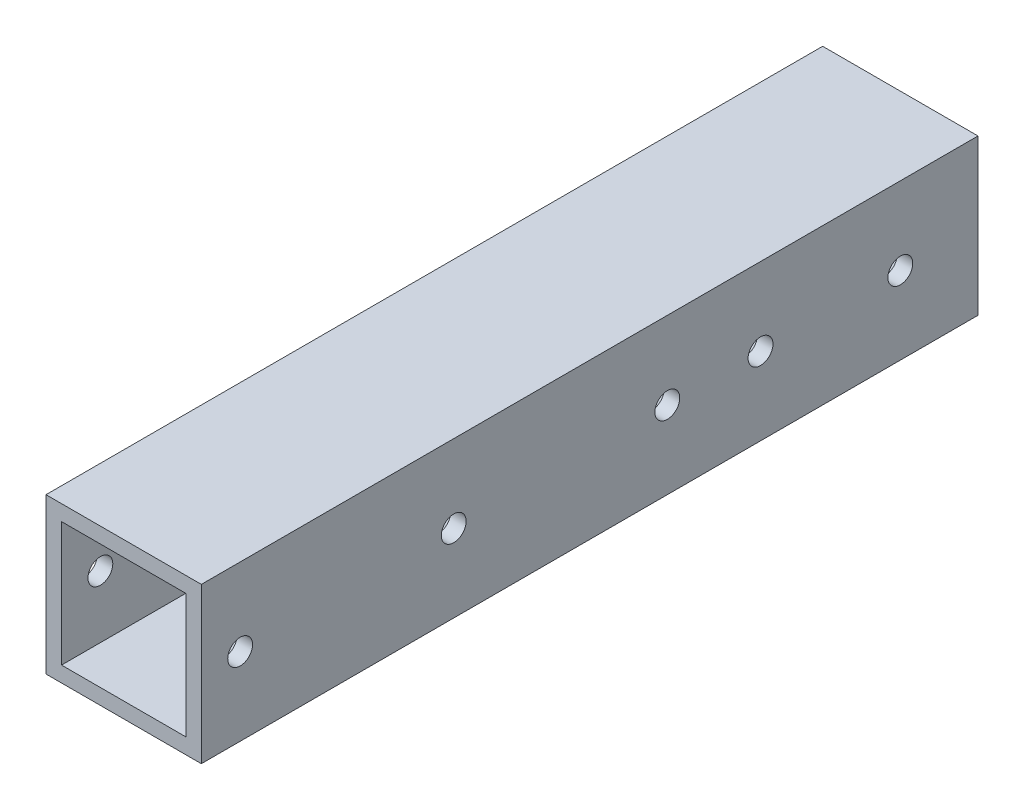
ISO-10303-21;
HEADER;
FILE_DESCRIPTION(('STEP AP214'),'2;1');
FILE_NAME('part.step','',(''),(''),'','','');
FILE_SCHEMA(('AUTOMOTIVE_DESIGN { 1 0 10303 214 1 1 1 1 }'));
ENDSEC;
DATA;
#1=APPLICATION_CONTEXT('core data for automotive mechanical design processes');
#2=APPLICATION_PROTOCOL_DEFINITION('international standard','automotive_design',2000,#1);
#3=PRODUCT_CONTEXT('',#1,'mechanical');
#4=PRODUCT('Part','Part','',(#3));
#5=PRODUCT_RELATED_PRODUCT_CATEGORY('part','',(#4));
#6=PRODUCT_DEFINITION_FORMATION('','',#4);
#7=PRODUCT_DEFINITION_CONTEXT('part definition',#1,'design');
#8=PRODUCT_DEFINITION('design','',#6,#7);
#9=PRODUCT_DEFINITION_SHAPE('','',#8);
#10=(LENGTH_UNIT() NAMED_UNIT(*) SI_UNIT(.MILLI.,.METRE.));
#11=(NAMED_UNIT(*) PLANE_ANGLE_UNIT() SI_UNIT($,.RADIAN.));
#12=(NAMED_UNIT(*) SI_UNIT($,.STERADIAN.) SOLID_ANGLE_UNIT());
#13=UNCERTAINTY_MEASURE_WITH_UNIT(LENGTH_MEASURE(1.E-05),#10,'distance_accuracy_value','');
#14=(GEOMETRIC_REPRESENTATION_CONTEXT(3) GLOBAL_UNCERTAINTY_ASSIGNED_CONTEXT((#13)) GLOBAL_UNIT_ASSIGNED_CONTEXT((#10,
#11,#12)) REPRESENTATION_CONTEXT('',''));
#15=CARTESIAN_POINT('',(0.,0.,0.));
#16=DIRECTION('',(0.,0.,1.));
#17=DIRECTION('',(1.,0.,0.));
#18=AXIS2_PLACEMENT_3D('',#15,#16,#17);
#19=CARTESIAN_POINT('',(0.,0.,100.));
#20=DIRECTION('',(0.,0.,1.));
#21=DIRECTION('',(1.,0.,0.));
#22=AXIS2_PLACEMENT_3D('',#19,#20,#21);
#23=PLANE('',#22);
#24=DIRECTION('',(0.,-1.,0.));
#25=VECTOR('',#24,1.);
#26=CARTESIAN_POINT('',(0.,0.,100.));
#27=LINE('',#26,#25);
#28=CARTESIAN_POINT('',(0.,20.,100.));
#29=VERTEX_POINT('',#28);
#30=CARTESIAN_POINT('',(0.,0.,100.));
#31=VERTEX_POINT('',#30);
#32=EDGE_CURVE('E176',#29,#31,#27,.T.);
#33=ORIENTED_EDGE('',*,*,#32,.T.);
#34=DIRECTION('',(1.,0.,0.));
#35=VECTOR('',#34,1.);
#36=CARTESIAN_POINT('',(0.,0.,100.));
#37=LINE('',#36,#35);
#38=CARTESIAN_POINT('',(20.,0.,100.));
#39=VERTEX_POINT('',#38);
#40=EDGE_CURVE('E179',#31,#39,#37,.T.);
#41=ORIENTED_EDGE('',*,*,#40,.T.);
#42=DIRECTION('',(0.,1.,0.));
#43=VECTOR('',#42,1.);
#44=CARTESIAN_POINT('',(20.,0.,100.));
#45=LINE('',#44,#43);
#46=CARTESIAN_POINT('',(20.,20.,100.));
#47=VERTEX_POINT('',#46);
#48=EDGE_CURVE('E182',#39,#47,#45,.T.);
#49=ORIENTED_EDGE('',*,*,#48,.T.);
#50=DIRECTION('',(-1.,0.,0.));
#51=VECTOR('',#50,1.);
#52=CARTESIAN_POINT('',(0.,20.,100.));
#53=LINE('',#52,#51);
#54=EDGE_CURVE('E184',#47,#29,#53,.T.);
#55=ORIENTED_EDGE('',*,*,#54,.T.);
#56=EDGE_LOOP('',(#33,#41,#49,#55));
#57=FACE_BOUND('',#56,.T.);
#58=DIRECTION('',(1.,0.,0.));
#59=VECTOR('',#58,1.);
#60=CARTESIAN_POINT('',(0.,2.,100.));
#61=LINE('',#60,#59);
#62=CARTESIAN_POINT('',(2.,2.,100.));
#63=VERTEX_POINT('',#62);
#64=CARTESIAN_POINT('',(18.,2.,100.));
#65=VERTEX_POINT('',#64);
#66=EDGE_CURVE('E146',#63,#65,#61,.T.);
#67=ORIENTED_EDGE('',*,*,#66,.F.);
#68=DIRECTION('',(0.,-1.,0.));
#69=VECTOR('',#68,1.);
#70=CARTESIAN_POINT('',(2.,0.,100.));
#71=LINE('',#70,#69);
#72=CARTESIAN_POINT('',(2.,18.,100.));
#73=VERTEX_POINT('',#72);
#74=EDGE_CURVE('E138',#73,#63,#71,.T.);
#75=ORIENTED_EDGE('',*,*,#74,.F.);
#76=DIRECTION('',(-1.,0.,0.));
#77=VECTOR('',#76,1.);
#78=CARTESIAN_POINT('',(0.,18.,100.));
#79=LINE('',#78,#77);
#80=CARTESIAN_POINT('',(18.,18.,100.));
#81=VERTEX_POINT('',#80);
#82=EDGE_CURVE('E160',#81,#73,#79,.T.);
#83=ORIENTED_EDGE('',*,*,#82,.F.);
#84=DIRECTION('',(0.,1.,0.));
#85=VECTOR('',#84,1.);
#86=CARTESIAN_POINT('',(18.,0.,100.));
#87=LINE('',#86,#85);
#88=EDGE_CURVE('E158',#65,#81,#87,.T.);
#89=ORIENTED_EDGE('',*,*,#88,.F.);
#90=EDGE_LOOP('',(#67,#75,#83,#89));
#91=FACE_BOUND('',#90,.T.);
#92=ADVANCED_FACE('F71',(#57,#91),#23,.T.);
#93=CARTESIAN_POINT('',(0.,0.,0.));
#94=DIRECTION('',(0.,0.,1.));
#95=DIRECTION('',(1.,0.,0.));
#96=AXIS2_PLACEMENT_3D('',#93,#94,#95);
#97=PLANE('',#96);
#98=DIRECTION('',(0.,-1.,0.));
#99=VECTOR('',#98,1.);
#100=CARTESIAN_POINT('',(0.,0.,0.));
#101=LINE('',#100,#99);
#102=CARTESIAN_POINT('',(0.,20.,0.));
#103=VERTEX_POINT('',#102);
#104=CARTESIAN_POINT('',(0.,0.,0.));
#105=VERTEX_POINT('',#104);
#106=EDGE_CURVE('E154',#103,#105,#101,.T.);
#107=ORIENTED_EDGE('',*,*,#106,.F.);
#108=DIRECTION('',(-1.,0.,0.));
#109=VECTOR('',#108,1.);
#110=CARTESIAN_POINT('',(0.,20.,0.));
#111=LINE('',#110,#109);
#112=CARTESIAN_POINT('',(20.,20.,0.));
#113=VERTEX_POINT('',#112);
#114=EDGE_CURVE('E180',#113,#103,#111,.T.);
#115=ORIENTED_EDGE('',*,*,#114,.F.);
#116=DIRECTION('',(0.,1.,0.));
#117=VECTOR('',#116,1.);
#118=CARTESIAN_POINT('',(20.,0.,0.));
#119=LINE('',#118,#117);
#120=CARTESIAN_POINT('',(20.,0.,0.));
#121=VERTEX_POINT('',#120);
#122=EDGE_CURVE('E191',#121,#113,#119,.T.);
#123=ORIENTED_EDGE('',*,*,#122,.F.);
#124=DIRECTION('',(1.,0.,0.));
#125=VECTOR('',#124,1.);
#126=CARTESIAN_POINT('',(0.,0.,0.));
#127=LINE('',#126,#125);
#128=EDGE_CURVE('E189',#105,#121,#127,.T.);
#129=ORIENTED_EDGE('',*,*,#128,.F.);
#130=EDGE_LOOP('',(#107,#115,#123,#129));
#131=FACE_BOUND('',#130,.T.);
#132=DIRECTION('',(0.,-1.,0.));
#133=VECTOR('',#132,1.);
#134=CARTESIAN_POINT('',(2.,0.,0.));
#135=LINE('',#134,#133);
#136=CARTESIAN_POINT('',(2.,18.,0.));
#137=VERTEX_POINT('',#136);
#138=CARTESIAN_POINT('',(2.,2.,0.));
#139=VERTEX_POINT('',#138);
#140=EDGE_CURVE('E96',#137,#139,#135,.T.);
#141=ORIENTED_EDGE('',*,*,#140,.T.);
#142=DIRECTION('',(1.,0.,0.));
#143=VECTOR('',#142,1.);
#144=CARTESIAN_POINT('',(0.,2.,0.));
#145=LINE('',#144,#143);
#146=CARTESIAN_POINT('',(18.,2.,0.));
#147=VERTEX_POINT('',#146);
#148=EDGE_CURVE('E153',#139,#147,#145,.T.);
#149=ORIENTED_EDGE('',*,*,#148,.T.);
#150=DIRECTION('',(0.,1.,0.));
#151=VECTOR('',#150,1.);
#152=CARTESIAN_POINT('',(18.,0.,0.));
#153=LINE('',#152,#151);
#154=CARTESIAN_POINT('',(18.,18.,0.));
#155=VERTEX_POINT('',#154);
#156=EDGE_CURVE('E168',#147,#155,#153,.T.);
#157=ORIENTED_EDGE('',*,*,#156,.T.);
#158=DIRECTION('',(-1.,0.,0.));
#159=VECTOR('',#158,1.);
#160=CARTESIAN_POINT('',(0.,18.,0.));
#161=LINE('',#160,#159);
#162=EDGE_CURVE('E147',#155,#137,#161,.T.);
#163=ORIENTED_EDGE('',*,*,#162,.T.);
#164=EDGE_LOOP('',(#141,#149,#157,#163));
#165=FACE_BOUND('',#164,.T.);
#166=ADVANCED_FACE('F267',(#131,#165),#97,.F.);
#167=CARTESIAN_POINT('',(0.,0.,100.));
#168=DIRECTION('',(1.,0.,0.));
#169=DIRECTION('',(0.,0.,-1.));
#170=AXIS2_PLACEMENT_3D('',#167,#168,#169);
#171=PLANE('',#170);
#172=CARTESIAN_POINT('',(0.,10.,95.));
#173=DIRECTION('',(-1.,0.,0.));
#174=DIRECTION('',(0.,0.,1.));
#175=AXIS2_PLACEMENT_3D('',#172,#173,#174);
#176=CIRCLE('',#175,1.6);
#177=CARTESIAN_POINT('',(0.,10.,96.6));
#178=VERTEX_POINT('',#177);
#179=EDGE_CURVE('E351',#178,#178,#176,.T.);
#180=ORIENTED_EDGE('',*,*,#179,.F.);
#181=EDGE_LOOP('',(#180));
#182=FACE_BOUND('',#181,.T.);
#183=CARTESIAN_POINT('',(0.,9.99999999999999,40.));
#184=DIRECTION('',(-1.,0.,0.));
#185=DIRECTION('',(0.,0.,1.));
#186=AXIS2_PLACEMENT_3D('',#183,#184,#185);
#187=CIRCLE('',#186,1.6);
#188=CARTESIAN_POINT('',(0.,9.99999999999999,41.6));
#189=VERTEX_POINT('',#188);
#190=EDGE_CURVE('E345',#189,#189,#187,.T.);
#191=ORIENTED_EDGE('',*,*,#190,.F.);
#192=EDGE_LOOP('',(#191));
#193=FACE_BOUND('',#192,.T.);
#194=CARTESIAN_POINT('',(0.,9.99999999999999,67.5));
#195=DIRECTION('',(-1.,0.,0.));
#196=DIRECTION('',(0.,0.,1.));
#197=AXIS2_PLACEMENT_3D('',#194,#195,#196);
#198=CIRCLE('',#197,1.6);
#199=CARTESIAN_POINT('',(0.,9.99999999999999,69.1));
#200=VERTEX_POINT('',#199);
#201=EDGE_CURVE('E225',#200,#200,#198,.T.);
#202=ORIENTED_EDGE('',*,*,#201,.F.);
#203=EDGE_LOOP('',(#202));
#204=FACE_BOUND('',#203,.T.);
#205=CARTESIAN_POINT('',(0.,10.,10.));
#206=DIRECTION('',(-1.,0.,0.));
#207=DIRECTION('',(0.,0.,1.));
#208=AXIS2_PLACEMENT_3D('',#205,#206,#207);
#209=CIRCLE('',#208,1.6);
#210=CARTESIAN_POINT('',(0.,10.,11.6));
#211=VERTEX_POINT('',#210);
#212=EDGE_CURVE('E234',#211,#211,#209,.T.);
#213=ORIENTED_EDGE('',*,*,#212,.F.);
#214=EDGE_LOOP('',(#213));
#215=FACE_BOUND('',#214,.T.);
#216=CARTESIAN_POINT('',(0.,10.,28.));
#217=DIRECTION('',(-1.,0.,0.));
#218=DIRECTION('',(0.,0.,1.));
#219=AXIS2_PLACEMENT_3D('',#216,#217,#218);
#220=CIRCLE('',#219,1.60000000000001);
#221=CARTESIAN_POINT('',(0.,10.,29.6));
#222=VERTEX_POINT('',#221);
#223=EDGE_CURVE('E237',#222,#222,#220,.T.);
#224=ORIENTED_EDGE('',*,*,#223,.F.);
#225=EDGE_LOOP('',(#224));
#226=FACE_BOUND('',#225,.T.);
#227=ORIENTED_EDGE('',*,*,#106,.T.);
#228=DIRECTION('',(0.,0.,-1.));
#229=VECTOR('',#228,1.);
#230=CARTESIAN_POINT('',(0.,0.,100.));
#231=LINE('',#230,#229);
#232=EDGE_CURVE('E12',#31,#105,#231,.T.);
#233=ORIENTED_EDGE('',*,*,#232,.F.);
#234=ORIENTED_EDGE('',*,*,#32,.F.);
#235=DIRECTION('',(0.,0.,-1.));
#236=VECTOR('',#235,1.);
#237=CARTESIAN_POINT('',(0.,20.,100.));
#238=LINE('',#237,#236);
#239=EDGE_CURVE('E186',#29,#103,#238,.T.);
#240=ORIENTED_EDGE('',*,*,#239,.T.);
#241=EDGE_LOOP('',(#227,#233,#234,#240));
#242=FACE_BOUND('',#241,.T.);
#243=ADVANCED_FACE('F73',(#182,#193,#204,#215,#226,#242),#171,.F.);
#244=CARTESIAN_POINT('',(0.,0.,100.));
#245=DIRECTION('',(0.,1.,0.));
#246=DIRECTION('',(0.,0.,1.));
#247=AXIS2_PLACEMENT_3D('',#244,#245,#246);
#248=PLANE('',#247);
#249=ORIENTED_EDGE('',*,*,#128,.T.);
#250=DIRECTION('',(0.,0.,-1.));
#251=VECTOR('',#250,1.);
#252=CARTESIAN_POINT('',(20.,0.,100.));
#253=LINE('',#252,#251);
#254=EDGE_CURVE('E80',#39,#121,#253,.T.);
#255=ORIENTED_EDGE('',*,*,#254,.F.);
#256=ORIENTED_EDGE('',*,*,#40,.F.);
#257=ORIENTED_EDGE('',*,*,#232,.T.);
#258=EDGE_LOOP('',(#249,#255,#256,#257));
#259=FACE_BOUND('',#258,.T.);
#260=ADVANCED_FACE('F266',(#259),#248,.F.);
#261=CARTESIAN_POINT('',(20.,0.,100.));
#262=DIRECTION('',(-1.,0.,0.));
#263=DIRECTION('',(0.,0.,1.));
#264=AXIS2_PLACEMENT_3D('',#261,#262,#263);
#265=PLANE('',#264);
#266=CARTESIAN_POINT('',(20.,10.,95.));
#267=DIRECTION('',(-1.,0.,0.));
#268=DIRECTION('',(0.,0.,1.));
#269=AXIS2_PLACEMENT_3D('',#266,#267,#268);
#270=CIRCLE('',#269,1.6);
#271=CARTESIAN_POINT('',(20.,10.,96.6));
#272=VERTEX_POINT('',#271);
#273=EDGE_CURVE('E356',#272,#272,#270,.T.);
#274=ORIENTED_EDGE('',*,*,#273,.T.);
#275=EDGE_LOOP('',(#274));
#276=FACE_BOUND('',#275,.T.);
#277=CARTESIAN_POINT('',(20.,9.99999999999999,40.));
#278=DIRECTION('',(-1.,0.,0.));
#279=DIRECTION('',(0.,0.,1.));
#280=AXIS2_PLACEMENT_3D('',#277,#278,#279);
#281=CIRCLE('',#280,1.6);
#282=CARTESIAN_POINT('',(20.,9.99999999999999,41.6));
#283=VERTEX_POINT('',#282);
#284=EDGE_CURVE('E347',#283,#283,#281,.T.);
#285=ORIENTED_EDGE('',*,*,#284,.T.);
#286=EDGE_LOOP('',(#285));
#287=FACE_BOUND('',#286,.T.);
#288=CARTESIAN_POINT('',(20.,9.99999999999999,67.5));
#289=DIRECTION('',(-1.,0.,0.));
#290=DIRECTION('',(0.,0.,1.));
#291=AXIS2_PLACEMENT_3D('',#288,#289,#290);
#292=CIRCLE('',#291,1.6);
#293=CARTESIAN_POINT('',(20.,9.99999999999999,69.1));
#294=VERTEX_POINT('',#293);
#295=EDGE_CURVE('E212',#294,#294,#292,.T.);
#296=ORIENTED_EDGE('',*,*,#295,.T.);
#297=EDGE_LOOP('',(#296));
#298=FACE_BOUND('',#297,.T.);
#299=CARTESIAN_POINT('',(20.,10.,10.));
#300=DIRECTION('',(-1.,0.,0.));
#301=DIRECTION('',(0.,0.,1.));
#302=AXIS2_PLACEMENT_3D('',#299,#300,#301);
#303=CIRCLE('',#302,1.6);
#304=CARTESIAN_POINT('',(20.,10.,11.6));
#305=VERTEX_POINT('',#304);
#306=EDGE_CURVE('E205',#305,#305,#303,.T.);
#307=ORIENTED_EDGE('',*,*,#306,.T.);
#308=EDGE_LOOP('',(#307));
#309=FACE_BOUND('',#308,.T.);
#310=CARTESIAN_POINT('',(20.,10.,28.));
#311=DIRECTION('',(-1.,0.,0.));
#312=DIRECTION('',(0.,0.,1.));
#313=AXIS2_PLACEMENT_3D('',#310,#311,#312);
#314=CIRCLE('',#313,1.60000000000001);
#315=CARTESIAN_POINT('',(20.,10.,29.6));
#316=VERTEX_POINT('',#315);
#317=EDGE_CURVE('E231',#316,#316,#314,.T.);
#318=ORIENTED_EDGE('',*,*,#317,.T.);
#319=EDGE_LOOP('',(#318));
#320=FACE_BOUND('',#319,.T.);
#321=ORIENTED_EDGE('',*,*,#122,.T.);
#322=DIRECTION('',(0.,0.,-1.));
#323=VECTOR('',#322,1.);
#324=CARTESIAN_POINT('',(20.,20.,100.));
#325=LINE('',#324,#323);
#326=EDGE_CURVE('E196',#47,#113,#325,.T.);
#327=ORIENTED_EDGE('',*,*,#326,.F.);
#328=ORIENTED_EDGE('',*,*,#48,.F.);
#329=ORIENTED_EDGE('',*,*,#254,.T.);
#330=EDGE_LOOP('',(#321,#327,#328,#329));
#331=FACE_BOUND('',#330,.T.);
#332=ADVANCED_FACE('F285',(#276,#287,#298,#309,#320,#331),#265,.F.);
#333=CARTESIAN_POINT('',(0.,20.,100.));
#334=DIRECTION('',(0.,-1.,0.));
#335=DIRECTION('',(0.,0.,-1.));
#336=AXIS2_PLACEMENT_3D('',#333,#334,#335);
#337=PLANE('',#336);
#338=ORIENTED_EDGE('',*,*,#114,.T.);
#339=ORIENTED_EDGE('',*,*,#239,.F.);
#340=ORIENTED_EDGE('',*,*,#54,.F.);
#341=ORIENTED_EDGE('',*,*,#326,.T.);
#342=EDGE_LOOP('',(#338,#339,#340,#341));
#343=FACE_BOUND('',#342,.T.);
#344=ADVANCED_FACE('F251',(#343),#337,.F.);
#345=CARTESIAN_POINT('',(2.,0.,100.));
#346=DIRECTION('',(1.,0.,0.));
#347=DIRECTION('',(0.,0.,-1.));
#348=AXIS2_PLACEMENT_3D('',#345,#346,#347);
#349=PLANE('',#348);
#350=CARTESIAN_POINT('',(2.,10.,95.));
#351=DIRECTION('',(1.,0.,0.));
#352=DIRECTION('',(0.,0.,-1.));
#353=AXIS2_PLACEMENT_3D('',#350,#351,#352);
#354=CIRCLE('',#353,1.6);
#355=CARTESIAN_POINT('',(2.,10.,93.4));
#356=VERTEX_POINT('',#355);
#357=EDGE_CURVE('E228',#356,#356,#354,.T.);
#358=ORIENTED_EDGE('',*,*,#357,.F.);
#359=EDGE_LOOP('',(#358));
#360=FACE_BOUND('',#359,.T.);
#361=CARTESIAN_POINT('',(2.,9.99999999999999,40.));
#362=DIRECTION('',(1.,0.,0.));
#363=DIRECTION('',(0.,0.,-1.));
#364=AXIS2_PLACEMENT_3D('',#361,#362,#363);
#365=CIRCLE('',#364,1.6);
#366=CARTESIAN_POINT('',(2.,9.99999999999999,38.4));
#367=VERTEX_POINT('',#366);
#368=EDGE_CURVE('E215',#367,#367,#365,.T.);
#369=ORIENTED_EDGE('',*,*,#368,.F.);
#370=EDGE_LOOP('',(#369));
#371=FACE_BOUND('',#370,.T.);
#372=CARTESIAN_POINT('',(2.,9.99999999999999,67.5));
#373=DIRECTION('',(1.,0.,0.));
#374=DIRECTION('',(0.,0.,-1.));
#375=AXIS2_PLACEMENT_3D('',#372,#373,#374);
#376=CIRCLE('',#375,1.6);
#377=CARTESIAN_POINT('',(2.,9.99999999999999,65.9));
#378=VERTEX_POINT('',#377);
#379=EDGE_CURVE('E211',#378,#378,#376,.T.);
#380=ORIENTED_EDGE('',*,*,#379,.F.);
#381=EDGE_LOOP('',(#380));
#382=FACE_BOUND('',#381,.T.);
#383=CARTESIAN_POINT('',(2.,10.,10.));
#384=DIRECTION('',(1.,0.,0.));
#385=DIRECTION('',(0.,0.,-1.));
#386=AXIS2_PLACEMENT_3D('',#383,#384,#385);
#387=CIRCLE('',#386,1.6);
#388=CARTESIAN_POINT('',(2.,10.,8.4));
#389=VERTEX_POINT('',#388);
#390=EDGE_CURVE('E166',#389,#389,#387,.T.);
#391=ORIENTED_EDGE('',*,*,#390,.F.);
#392=EDGE_LOOP('',(#391));
#393=FACE_BOUND('',#392,.T.);
#394=CARTESIAN_POINT('',(2.,10.,28.));
#395=DIRECTION('',(1.,0.,0.));
#396=DIRECTION('',(0.,0.,-1.));
#397=AXIS2_PLACEMENT_3D('',#394,#395,#396);
#398=CIRCLE('',#397,1.60000000000001);
#399=CARTESIAN_POINT('',(2.,10.,26.4));
#400=VERTEX_POINT('',#399);
#401=EDGE_CURVE('E204',#400,#400,#398,.T.);
#402=ORIENTED_EDGE('',*,*,#401,.F.);
#403=EDGE_LOOP('',(#402));
#404=FACE_BOUND('',#403,.T.);
#405=ORIENTED_EDGE('',*,*,#140,.F.);
#406=DIRECTION('',(0.,0.,-1.));
#407=VECTOR('',#406,1.);
#408=CARTESIAN_POINT('',(2.,18.,100.));
#409=LINE('',#408,#407);
#410=EDGE_CURVE('E142',#73,#137,#409,.T.);
#411=ORIENTED_EDGE('',*,*,#410,.F.);
#412=ORIENTED_EDGE('',*,*,#74,.T.);
#413=DIRECTION('',(0.,0.,-1.));
#414=VECTOR('',#413,1.);
#415=CARTESIAN_POINT('',(2.,2.,100.));
#416=LINE('',#415,#414);
#417=EDGE_CURVE('E141',#63,#139,#416,.T.);
#418=ORIENTED_EDGE('',*,*,#417,.T.);
#419=EDGE_LOOP('',(#405,#411,#412,#418));
#420=FACE_BOUND('',#419,.T.);
#421=ADVANCED_FACE('F140',(#360,#371,#382,#393,#404,#420),#349,.T.);
#422=CARTESIAN_POINT('',(0.,2.,100.));
#423=DIRECTION('',(0.,1.,0.));
#424=DIRECTION('',(0.,0.,1.));
#425=AXIS2_PLACEMENT_3D('',#422,#423,#424);
#426=PLANE('',#425);
#427=ORIENTED_EDGE('',*,*,#148,.F.);
#428=ORIENTED_EDGE('',*,*,#417,.F.);
#429=ORIENTED_EDGE('',*,*,#66,.T.);
#430=DIRECTION('',(0.,0.,-1.));
#431=VECTOR('',#430,1.);
#432=CARTESIAN_POINT('',(18.,2.,100.));
#433=LINE('',#432,#431);
#434=EDGE_CURVE('E155',#65,#147,#433,.T.);
#435=ORIENTED_EDGE('',*,*,#434,.T.);
#436=EDGE_LOOP('',(#427,#428,#429,#435));
#437=FACE_BOUND('',#436,.T.);
#438=ADVANCED_FACE('F150',(#437),#426,.T.);
#439=CARTESIAN_POINT('',(18.,0.,100.));
#440=DIRECTION('',(-1.,0.,0.));
#441=DIRECTION('',(0.,0.,1.));
#442=AXIS2_PLACEMENT_3D('',#439,#440,#441);
#443=PLANE('',#442);
#444=CARTESIAN_POINT('',(18.,10.,95.));
#445=DIRECTION('',(-1.,0.,0.));
#446=DIRECTION('',(0.,0.,1.));
#447=AXIS2_PLACEMENT_3D('',#444,#445,#446);
#448=CIRCLE('',#447,1.6);
#449=CARTESIAN_POINT('',(18.,10.,96.6));
#450=VERTEX_POINT('',#449);
#451=EDGE_CURVE('E75',#450,#450,#448,.T.);
#452=ORIENTED_EDGE('',*,*,#451,.F.);
#453=EDGE_LOOP('',(#452));
#454=FACE_BOUND('',#453,.T.);
#455=CARTESIAN_POINT('',(18.,9.99999999999999,40.));
#456=DIRECTION('',(-1.,0.,0.));
#457=DIRECTION('',(0.,0.,1.));
#458=AXIS2_PLACEMENT_3D('',#455,#456,#457);
#459=CIRCLE('',#458,1.6);
#460=CARTESIAN_POINT('',(18.,9.99999999999999,41.6));
#461=VERTEX_POINT('',#460);
#462=EDGE_CURVE('E213',#461,#461,#459,.T.);
#463=ORIENTED_EDGE('',*,*,#462,.F.);
#464=EDGE_LOOP('',(#463));
#465=FACE_BOUND('',#464,.T.);
#466=CARTESIAN_POINT('',(18.,9.99999999999999,67.5));
#467=DIRECTION('',(-1.,0.,0.));
#468=DIRECTION('',(0.,0.,1.));
#469=AXIS2_PLACEMENT_3D('',#466,#467,#468);
#470=CIRCLE('',#469,1.6);
#471=CARTESIAN_POINT('',(18.,9.99999999999999,69.1));
#472=VERTEX_POINT('',#471);
#473=EDGE_CURVE('E209',#472,#472,#470,.T.);
#474=ORIENTED_EDGE('',*,*,#473,.F.);
#475=EDGE_LOOP('',(#474));
#476=FACE_BOUND('',#475,.T.);
#477=CARTESIAN_POINT('',(18.,10.,10.));
#478=DIRECTION('',(-1.,0.,0.));
#479=DIRECTION('',(0.,0.,1.));
#480=AXIS2_PLACEMENT_3D('',#477,#478,#479);
#481=CIRCLE('',#480,1.6);
#482=CARTESIAN_POINT('',(18.,10.,11.6));
#483=VERTEX_POINT('',#482);
#484=EDGE_CURVE('E206',#483,#483,#481,.T.);
#485=ORIENTED_EDGE('',*,*,#484,.F.);
#486=EDGE_LOOP('',(#485));
#487=FACE_BOUND('',#486,.T.);
#488=CARTESIAN_POINT('',(18.,10.,28.));
#489=DIRECTION('',(-1.,0.,0.));
#490=DIRECTION('',(0.,0.,1.));
#491=AXIS2_PLACEMENT_3D('',#488,#489,#490);
#492=CIRCLE('',#491,1.60000000000001);
#493=CARTESIAN_POINT('',(18.,10.,29.6));
#494=VERTEX_POINT('',#493);
#495=EDGE_CURVE('E201',#494,#494,#492,.T.);
#496=ORIENTED_EDGE('',*,*,#495,.F.);
#497=EDGE_LOOP('',(#496));
#498=FACE_BOUND('',#497,.T.);
#499=ORIENTED_EDGE('',*,*,#156,.F.);
#500=ORIENTED_EDGE('',*,*,#434,.F.);
#501=ORIENTED_EDGE('',*,*,#88,.T.);
#502=DIRECTION('',(0.,0.,-1.));
#503=VECTOR('',#502,1.);
#504=CARTESIAN_POINT('',(18.,18.,100.));
#505=LINE('',#504,#503);
#506=EDGE_CURVE('E88',#81,#155,#505,.T.);
#507=ORIENTED_EDGE('',*,*,#506,.T.);
#508=EDGE_LOOP('',(#499,#500,#501,#507));
#509=FACE_BOUND('',#508,.T.);
#510=ADVANCED_FACE('F306',(#454,#465,#476,#487,#498,#509),#443,.T.);
#511=CARTESIAN_POINT('',(0.,18.,100.));
#512=DIRECTION('',(0.,-1.,0.));
#513=DIRECTION('',(0.,0.,-1.));
#514=AXIS2_PLACEMENT_3D('',#511,#512,#513);
#515=PLANE('',#514);
#516=ORIENTED_EDGE('',*,*,#162,.F.);
#517=ORIENTED_EDGE('',*,*,#506,.F.);
#518=ORIENTED_EDGE('',*,*,#82,.T.);
#519=ORIENTED_EDGE('',*,*,#410,.T.);
#520=EDGE_LOOP('',(#516,#517,#518,#519));
#521=FACE_BOUND('',#520,.T.);
#522=ADVANCED_FACE('F309',(#521),#515,.T.);
#523=CARTESIAN_POINT('',(20.,10.,28.));
#524=DIRECTION('',(-1.,0.,0.));
#525=DIRECTION('',(0.,0.,1.));
#526=AXIS2_PLACEMENT_3D('',#523,#524,#525);
#527=CYLINDRICAL_SURFACE('',#526,1.60000000000001);
#528=ORIENTED_EDGE('',*,*,#495,.T.);
#529=EDGE_LOOP('',(#528));
#530=FACE_BOUND('',#529,.T.);
#531=ORIENTED_EDGE('',*,*,#317,.F.);
#532=EDGE_LOOP('',(#531));
#533=FACE_BOUND('',#532,.T.);
#534=ADVANCED_FACE('F261',(#530,#533),#527,.F.);
#535=CARTESIAN_POINT('',(20.,10.,10.));
#536=DIRECTION('',(-1.,0.,0.));
#537=DIRECTION('',(0.,0.,1.));
#538=AXIS2_PLACEMENT_3D('',#535,#536,#537);
#539=CYLINDRICAL_SURFACE('',#538,1.6);
#540=ORIENTED_EDGE('',*,*,#484,.T.);
#541=EDGE_LOOP('',(#540));
#542=FACE_BOUND('',#541,.T.);
#543=ORIENTED_EDGE('',*,*,#306,.F.);
#544=EDGE_LOOP('',(#543));
#545=FACE_BOUND('',#544,.T.);
#546=ADVANCED_FACE('F259',(#542,#545),#539,.F.);
#547=ORIENTED_EDGE('',*,*,#401,.T.);
#548=EDGE_LOOP('',(#547));
#549=FACE_BOUND('',#548,.T.);
#550=ORIENTED_EDGE('',*,*,#223,.T.);
#551=EDGE_LOOP('',(#550));
#552=FACE_BOUND('',#551,.T.);
#553=ADVANCED_FACE('F256',(#549,#552),#527,.F.);
#554=ORIENTED_EDGE('',*,*,#390,.T.);
#555=EDGE_LOOP('',(#554));
#556=FACE_BOUND('',#555,.T.);
#557=ORIENTED_EDGE('',*,*,#212,.T.);
#558=EDGE_LOOP('',(#557));
#559=FACE_BOUND('',#558,.T.);
#560=ADVANCED_FACE('F246',(#556,#559),#539,.F.);
#561=CARTESIAN_POINT('',(20.,9.99999999999999,67.5));
#562=DIRECTION('',(-1.,0.,0.));
#563=DIRECTION('',(0.,0.,1.));
#564=AXIS2_PLACEMENT_3D('',#561,#562,#563);
#565=CYLINDRICAL_SURFACE('',#564,1.6);
#566=ORIENTED_EDGE('',*,*,#473,.T.);
#567=EDGE_LOOP('',(#566));
#568=FACE_BOUND('',#567,.T.);
#569=ORIENTED_EDGE('',*,*,#295,.F.);
#570=EDGE_LOOP('',(#569));
#571=FACE_BOUND('',#570,.T.);
#572=ADVANCED_FACE('F318',(#568,#571),#565,.F.);
#573=CARTESIAN_POINT('',(20.,9.99999999999999,40.));
#574=DIRECTION('',(-1.,0.,0.));
#575=DIRECTION('',(0.,0.,1.));
#576=AXIS2_PLACEMENT_3D('',#573,#574,#575);
#577=CYLINDRICAL_SURFACE('',#576,1.6);
#578=ORIENTED_EDGE('',*,*,#462,.T.);
#579=EDGE_LOOP('',(#578));
#580=FACE_BOUND('',#579,.T.);
#581=ORIENTED_EDGE('',*,*,#284,.F.);
#582=EDGE_LOOP('',(#581));
#583=FACE_BOUND('',#582,.T.);
#584=ADVANCED_FACE('F321',(#580,#583),#577,.F.);
#585=CARTESIAN_POINT('',(20.,10.,95.));
#586=DIRECTION('',(-1.,0.,0.));
#587=DIRECTION('',(0.,0.,1.));
#588=AXIS2_PLACEMENT_3D('',#585,#586,#587);
#589=CYLINDRICAL_SURFACE('',#588,1.6);
#590=ORIENTED_EDGE('',*,*,#451,.T.);
#591=EDGE_LOOP('',(#590));
#592=FACE_BOUND('',#591,.T.);
#593=ORIENTED_EDGE('',*,*,#273,.F.);
#594=EDGE_LOOP('',(#593));
#595=FACE_BOUND('',#594,.T.);
#596=ADVANCED_FACE('F324',(#592,#595),#589,.F.);
#597=ORIENTED_EDGE('',*,*,#379,.T.);
#598=EDGE_LOOP('',(#597));
#599=FACE_BOUND('',#598,.T.);
#600=ORIENTED_EDGE('',*,*,#201,.T.);
#601=EDGE_LOOP('',(#600));
#602=FACE_BOUND('',#601,.T.);
#603=ADVANCED_FACE('F323',(#599,#602),#565,.F.);
#604=ORIENTED_EDGE('',*,*,#368,.T.);
#605=EDGE_LOOP('',(#604));
#606=FACE_BOUND('',#605,.T.);
#607=ORIENTED_EDGE('',*,*,#190,.T.);
#608=EDGE_LOOP('',(#607));
#609=FACE_BOUND('',#608,.T.);
#610=ADVANCED_FACE('F330',(#606,#609),#577,.F.);
#611=ORIENTED_EDGE('',*,*,#357,.T.);
#612=EDGE_LOOP('',(#611));
#613=FACE_BOUND('',#612,.T.);
#614=ORIENTED_EDGE('',*,*,#179,.T.);
#615=EDGE_LOOP('',(#614));
#616=FACE_BOUND('',#615,.T.);
#617=ADVANCED_FACE('F328',(#613,#616),#589,.F.);
#618=CLOSED_SHELL('',(#92,#166,#243,#260,#332,#344,#421,#438,#510,#522,#534,#546,#553,#560,#572,
#584,#596,#603,#610,#617));
#619=MANIFOLD_SOLID_BREP('B2',#618);
#620=ADVANCED_BREP_SHAPE_REPRESENTATION('',(#18,#619),#14);
#621=SHAPE_DEFINITION_REPRESENTATION(#9,#620);
ENDSEC;
END-ISO-10303-21;
